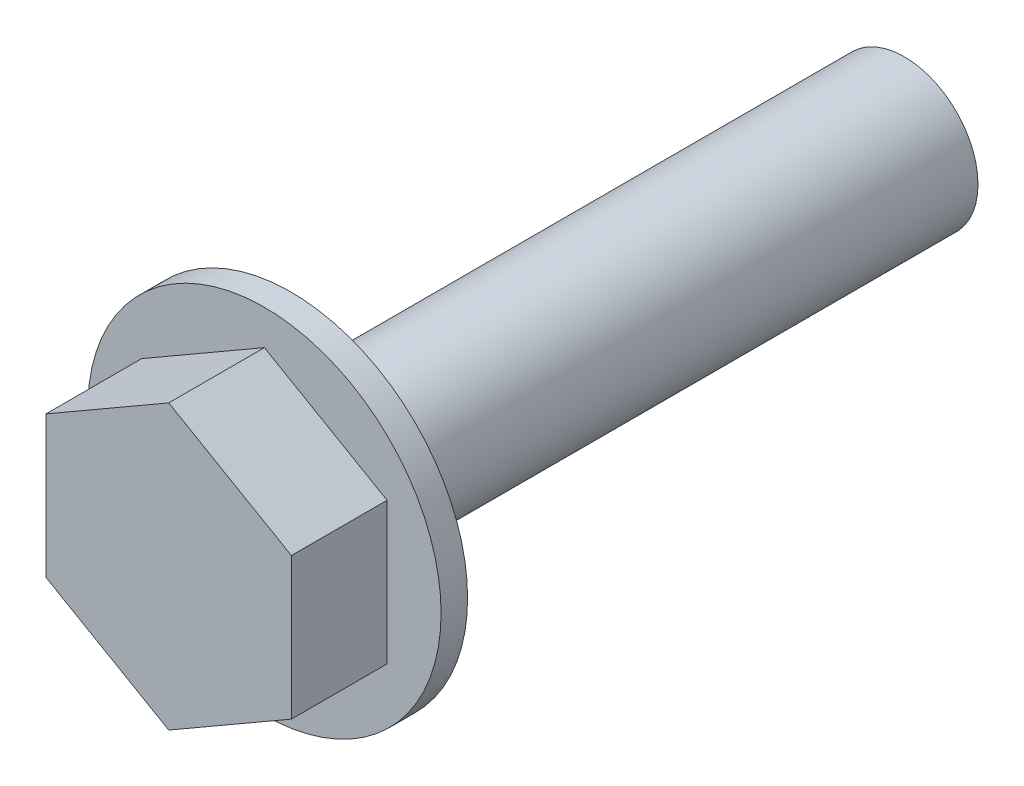
ISO-10303-21;
HEADER;
FILE_DESCRIPTION(('STEP AP214'),'2;1');
FILE_NAME('part.step','',(''),(''),'','','');
FILE_SCHEMA(('AUTOMOTIVE_DESIGN { 1 0 10303 214 1 1 1 1 }'));
ENDSEC;
DATA;
#1=APPLICATION_CONTEXT('core data for automotive mechanical design processes');
#2=APPLICATION_PROTOCOL_DEFINITION('international standard','automotive_design',2000,#1);
#3=PRODUCT_CONTEXT('',#1,'mechanical');
#4=PRODUCT('Part','Part','',(#3));
#5=PRODUCT_RELATED_PRODUCT_CATEGORY('part','',(#4));
#6=PRODUCT_DEFINITION_FORMATION('','',#4);
#7=PRODUCT_DEFINITION_CONTEXT('part definition',#1,'design');
#8=PRODUCT_DEFINITION('design','',#6,#7);
#9=PRODUCT_DEFINITION_SHAPE('','',#8);
#10=(LENGTH_UNIT() NAMED_UNIT(*) SI_UNIT(.MILLI.,.METRE.));
#11=(NAMED_UNIT(*) PLANE_ANGLE_UNIT() SI_UNIT($,.RADIAN.));
#12=(NAMED_UNIT(*) SI_UNIT($,.STERADIAN.) SOLID_ANGLE_UNIT());
#13=UNCERTAINTY_MEASURE_WITH_UNIT(LENGTH_MEASURE(1.E-05),#10,'distance_accuracy_value','');
#14=(GEOMETRIC_REPRESENTATION_CONTEXT(3) GLOBAL_UNCERTAINTY_ASSIGNED_CONTEXT((#13)) GLOBAL_UNIT_ASSIGNED_CONTEXT((#10,
#11,#12)) REPRESENTATION_CONTEXT('',''));
#15=CARTESIAN_POINT('',(0.,0.,0.));
#16=DIRECTION('',(0.,0.,1.));
#17=DIRECTION('',(1.,0.,0.));
#18=AXIS2_PLACEMENT_3D('',#15,#16,#17);
#19=CARTESIAN_POINT('',(5.,-2.88675134594813,4.98));
#20=DIRECTION('',(-1.,0.,0.));
#21=DIRECTION('',(0.,-1.,0.));
#22=AXIS2_PLACEMENT_3D('',#19,#20,#21);
#23=PLANE('',#22);
#24=DIRECTION('',(0.,1.,0.));
#25=VECTOR('',#24,1.);
#26=CARTESIAN_POINT('',(5.,-2.88675134594813,1.08));
#27=LINE('',#26,#25);
#28=CARTESIAN_POINT('',(5.,-2.88675134594813,1.08));
#29=VERTEX_POINT('',#28);
#30=CARTESIAN_POINT('',(5.,2.88675134594813,1.08));
#31=VERTEX_POINT('',#30);
#32=EDGE_CURVE('E95',#29,#31,#27,.T.);
#33=ORIENTED_EDGE('',*,*,#32,.T.);
#34=DIRECTION('',(0.,0.,-1.));
#35=VECTOR('',#34,1.);
#36=CARTESIAN_POINT('',(5.,2.88675134594813,4.98));
#37=LINE('',#36,#35);
#38=CARTESIAN_POINT('',(5.,2.88675134594813,4.98));
#39=VERTEX_POINT('',#38);
#40=EDGE_CURVE('E11',#39,#31,#37,.T.);
#41=ORIENTED_EDGE('',*,*,#40,.F.);
#42=DIRECTION('',(0.,1.,0.));
#43=VECTOR('',#42,1.);
#44=CARTESIAN_POINT('',(5.,-2.88675134594813,4.98));
#45=LINE('',#44,#43);
#46=CARTESIAN_POINT('',(5.,-2.88675134594813,4.98));
#47=VERTEX_POINT('',#46);
#48=EDGE_CURVE('E124',#47,#39,#45,.T.);
#49=ORIENTED_EDGE('',*,*,#48,.F.);
#50=DIRECTION('',(0.,0.,-1.));
#51=VECTOR('',#50,1.);
#52=CARTESIAN_POINT('',(5.,-2.88675134594813,4.98));
#53=LINE('',#52,#51);
#54=EDGE_CURVE('E106',#47,#29,#53,.T.);
#55=ORIENTED_EDGE('',*,*,#54,.T.);
#56=EDGE_LOOP('',(#33,#41,#49,#55));
#57=FACE_BOUND('',#56,.T.);
#58=ADVANCED_FACE('F41',(#57),#23,.F.);
#59=CARTESIAN_POINT('',(5.,2.88675134594813,4.98));
#60=DIRECTION('',(-0.5,-0.866025403784439,0.));
#61=DIRECTION('',(0.866025403784439,-0.5,0.));
#62=AXIS2_PLACEMENT_3D('',#59,#60,#61);
#63=PLANE('',#62);
#64=DIRECTION('',(-0.866025403784439,0.5,0.));
#65=VECTOR('',#64,1.);
#66=CARTESIAN_POINT('',(5.,2.88675134594813,1.08));
#67=LINE('',#66,#65);
#68=CARTESIAN_POINT('',(0.,5.77350269189626,1.08));
#69=VERTEX_POINT('',#68);
#70=EDGE_CURVE('E90',#31,#69,#67,.T.);
#71=ORIENTED_EDGE('',*,*,#70,.T.);
#72=DIRECTION('',(0.,0.,-1.));
#73=VECTOR('',#72,1.);
#74=CARTESIAN_POINT('',(0.,5.77350269189626,4.98));
#75=LINE('',#74,#73);
#76=CARTESIAN_POINT('',(0.,5.77350269189626,4.98));
#77=VERTEX_POINT('',#76);
#78=EDGE_CURVE('E47',#77,#69,#75,.T.);
#79=ORIENTED_EDGE('',*,*,#78,.F.);
#80=DIRECTION('',(-0.866025403784439,0.5,0.));
#81=VECTOR('',#80,1.);
#82=CARTESIAN_POINT('',(5.,2.88675134594813,4.98));
#83=LINE('',#82,#81);
#84=EDGE_CURVE('E105',#39,#77,#83,.T.);
#85=ORIENTED_EDGE('',*,*,#84,.F.);
#86=ORIENTED_EDGE('',*,*,#40,.T.);
#87=EDGE_LOOP('',(#71,#79,#85,#86));
#88=FACE_BOUND('',#87,.T.);
#89=ADVANCED_FACE('F101',(#88),#63,.F.);
#90=CARTESIAN_POINT('',(0.,5.77350269189626,4.98));
#91=DIRECTION('',(0.5,-0.866025403784439,0.));
#92=DIRECTION('',(0.866025403784439,0.5,0.));
#93=AXIS2_PLACEMENT_3D('',#90,#91,#92);
#94=PLANE('',#93);
#95=DIRECTION('',(-0.866025403784439,-0.5,0.));
#96=VECTOR('',#95,1.);
#97=CARTESIAN_POINT('',(0.,5.77350269189626,1.08));
#98=LINE('',#97,#96);
#99=CARTESIAN_POINT('',(-5.,2.88675134594813,1.08));
#100=VERTEX_POINT('',#99);
#101=EDGE_CURVE('E92',#69,#100,#98,.T.);
#102=ORIENTED_EDGE('',*,*,#101,.T.);
#103=DIRECTION('',(0.,0.,-1.));
#104=VECTOR('',#103,1.);
#105=CARTESIAN_POINT('',(-5.,2.88675134594813,4.98));
#106=LINE('',#105,#104);
#107=CARTESIAN_POINT('',(-5.,2.88675134594813,4.98));
#108=VERTEX_POINT('',#107);
#109=EDGE_CURVE('E135',#108,#100,#106,.T.);
#110=ORIENTED_EDGE('',*,*,#109,.F.);
#111=DIRECTION('',(-0.866025403784439,-0.5,0.));
#112=VECTOR('',#111,1.);
#113=CARTESIAN_POINT('',(0.,5.77350269189626,4.98));
#114=LINE('',#113,#112);
#115=EDGE_CURVE('E138',#77,#108,#114,.T.);
#116=ORIENTED_EDGE('',*,*,#115,.F.);
#117=ORIENTED_EDGE('',*,*,#78,.T.);
#118=EDGE_LOOP('',(#102,#110,#116,#117));
#119=FACE_BOUND('',#118,.T.);
#120=ADVANCED_FACE('F137',(#119),#94,.F.);
#121=CARTESIAN_POINT('',(-5.,2.88675134594813,4.98));
#122=DIRECTION('',(1.,0.,0.));
#123=DIRECTION('',(0.,1.,0.));
#124=AXIS2_PLACEMENT_3D('',#121,#122,#123);
#125=PLANE('',#124);
#126=DIRECTION('',(0.,-1.,0.));
#127=VECTOR('',#126,1.);
#128=CARTESIAN_POINT('',(-5.,2.88675134594813,1.08));
#129=LINE('',#128,#127);
#130=CARTESIAN_POINT('',(-5.,-2.88675134594813,1.08));
#131=VERTEX_POINT('',#130);
#132=EDGE_CURVE('E117',#100,#131,#129,.T.);
#133=ORIENTED_EDGE('',*,*,#132,.T.);
#134=DIRECTION('',(0.,0.,-1.));
#135=VECTOR('',#134,1.);
#136=CARTESIAN_POINT('',(-5.,-2.88675134594813,4.98));
#137=LINE('',#136,#135);
#138=CARTESIAN_POINT('',(-5.,-2.88675134594813,4.98));
#139=VERTEX_POINT('',#138);
#140=EDGE_CURVE('E129',#139,#131,#137,.T.);
#141=ORIENTED_EDGE('',*,*,#140,.F.);
#142=DIRECTION('',(0.,-1.,0.));
#143=VECTOR('',#142,1.);
#144=CARTESIAN_POINT('',(-5.,2.88675134594813,4.98));
#145=LINE('',#144,#143);
#146=EDGE_CURVE('E136',#108,#139,#145,.T.);
#147=ORIENTED_EDGE('',*,*,#146,.F.);
#148=ORIENTED_EDGE('',*,*,#109,.T.);
#149=EDGE_LOOP('',(#133,#141,#147,#148));
#150=FACE_BOUND('',#149,.T.);
#151=ADVANCED_FACE('F179',(#150),#125,.F.);
#152=CARTESIAN_POINT('',(-5.,-2.88675134594813,4.98));
#153=DIRECTION('',(0.5,0.866025403784438,0.));
#154=DIRECTION('',(-0.866025403784439,0.5,0.));
#155=AXIS2_PLACEMENT_3D('',#152,#153,#154);
#156=PLANE('',#155);
#157=DIRECTION('',(0.866025403784438,-0.5,0.));
#158=VECTOR('',#157,1.);
#159=CARTESIAN_POINT('',(-5.,-2.88675134594813,1.08));
#160=LINE('',#159,#158);
#161=CARTESIAN_POINT('',(0.,-5.77350269189626,1.08));
#162=VERTEX_POINT('',#161);
#163=EDGE_CURVE('E116',#131,#162,#160,.T.);
#164=ORIENTED_EDGE('',*,*,#163,.T.);
#165=DIRECTION('',(0.,0.,-1.));
#166=VECTOR('',#165,1.);
#167=CARTESIAN_POINT('',(0.,-5.77350269189626,4.98));
#168=LINE('',#167,#166);
#169=CARTESIAN_POINT('',(0.,-5.77350269189626,4.98));
#170=VERTEX_POINT('',#169);
#171=EDGE_CURVE('E127',#170,#162,#168,.T.);
#172=ORIENTED_EDGE('',*,*,#171,.F.);
#173=DIRECTION('',(0.866025403784438,-0.5,0.));
#174=VECTOR('',#173,1.);
#175=CARTESIAN_POINT('',(-5.,-2.88675134594813,4.98));
#176=LINE('',#175,#174);
#177=EDGE_CURVE('E142',#139,#170,#176,.T.);
#178=ORIENTED_EDGE('',*,*,#177,.F.);
#179=ORIENTED_EDGE('',*,*,#140,.T.);
#180=EDGE_LOOP('',(#164,#172,#178,#179));
#181=FACE_BOUND('',#180,.T.);
#182=ADVANCED_FACE('F151',(#181),#156,.F.);
#183=CARTESIAN_POINT('',(0.,-5.77350269189626,4.98));
#184=DIRECTION('',(-0.5,0.866025403784438,0.));
#185=DIRECTION('',(-0.866025403784439,-0.5,0.));
#186=AXIS2_PLACEMENT_3D('',#183,#184,#185);
#187=PLANE('',#186);
#188=DIRECTION('',(0.866025403784438,0.5,0.));
#189=VECTOR('',#188,1.);
#190=CARTESIAN_POINT('',(0.,-5.77350269189626,1.08));
#191=LINE('',#190,#189);
#192=EDGE_CURVE('E125',#162,#29,#191,.T.);
#193=ORIENTED_EDGE('',*,*,#192,.T.);
#194=ORIENTED_EDGE('',*,*,#54,.F.);
#195=DIRECTION('',(0.866025403784438,0.5,0.));
#196=VECTOR('',#195,1.);
#197=CARTESIAN_POINT('',(0.,-5.77350269189626,4.98));
#198=LINE('',#197,#196);
#199=EDGE_CURVE('E57',#170,#47,#198,.T.);
#200=ORIENTED_EDGE('',*,*,#199,.F.);
#201=ORIENTED_EDGE('',*,*,#171,.T.);
#202=EDGE_LOOP('',(#193,#194,#200,#201));
#203=FACE_BOUND('',#202,.T.);
#204=ADVANCED_FACE('F153',(#203),#187,.F.);
#205=CARTESIAN_POINT('',(0.,0.,4.98));
#206=DIRECTION('',(0.,0.,1.));
#207=DIRECTION('',(1.,0.,0.));
#208=AXIS2_PLACEMENT_3D('',#205,#206,#207);
#209=PLANE('',#208);
#210=ORIENTED_EDGE('',*,*,#48,.T.);
#211=ORIENTED_EDGE('',*,*,#84,.T.);
#212=ORIENTED_EDGE('',*,*,#115,.T.);
#213=ORIENTED_EDGE('',*,*,#146,.T.);
#214=ORIENTED_EDGE('',*,*,#177,.T.);
#215=ORIENTED_EDGE('',*,*,#199,.T.);
#216=EDGE_LOOP('',(#210,#211,#212,#213,#214,#215));
#217=FACE_BOUND('',#216,.T.);
#218=ADVANCED_FACE('F146',(#217),#209,.T.);
#219=CARTESIAN_POINT('',(0.,0.,1.08));
#220=DIRECTION('',(0.,0.,1.));
#221=DIRECTION('',(1.,0.,0.));
#222=AXIS2_PLACEMENT_3D('',#219,#220,#221);
#223=PLANE('',#222);
#224=CARTESIAN_POINT('',(0.,0.,1.08));
#225=DIRECTION('',(0.,0.,1.));
#226=DIRECTION('',(1.,0.,0.));
#227=AXIS2_PLACEMENT_3D('',#224,#225,#226);
#228=CIRCLE('',#227,7.2);
#229=CARTESIAN_POINT('',(7.2,0.,1.08));
#230=VERTEX_POINT('',#229);
#231=EDGE_CURVE('E109',#230,#230,#228,.T.);
#232=ORIENTED_EDGE('',*,*,#231,.T.);
#233=EDGE_LOOP('',(#232));
#234=FACE_BOUND('',#233,.T.);
#235=ORIENTED_EDGE('',*,*,#32,.F.);
#236=ORIENTED_EDGE('',*,*,#192,.F.);
#237=ORIENTED_EDGE('',*,*,#163,.F.);
#238=ORIENTED_EDGE('',*,*,#132,.F.);
#239=ORIENTED_EDGE('',*,*,#101,.F.);
#240=ORIENTED_EDGE('',*,*,#70,.F.);
#241=EDGE_LOOP('',(#235,#236,#237,#238,#239,#240));
#242=FACE_BOUND('',#241,.T.);
#243=ADVANCED_FACE('F89',(#234,#242),#223,.T.);
#244=CARTESIAN_POINT('',(0.,0.,1.08));
#245=DIRECTION('',(0.,0.,-1.));
#246=DIRECTION('',(-1.,0.,0.));
#247=AXIS2_PLACEMENT_3D('',#244,#245,#246);
#248=CYLINDRICAL_SURFACE('',#247,7.2);
#249=ORIENTED_EDGE('',*,*,#231,.F.);
#250=EDGE_LOOP('',(#249));
#251=FACE_BOUND('',#250,.T.);
#252=CARTESIAN_POINT('',(0.,0.,0.));
#253=DIRECTION('',(0.,0.,1.));
#254=DIRECTION('',(1.,0.,0.));
#255=AXIS2_PLACEMENT_3D('',#252,#253,#254);
#256=CIRCLE('',#255,7.2);
#257=CARTESIAN_POINT('',(7.2,0.,0.));
#258=VERTEX_POINT('',#257);
#259=EDGE_CURVE('E154',#258,#258,#256,.T.);
#260=ORIENTED_EDGE('',*,*,#259,.T.);
#261=EDGE_LOOP('',(#260));
#262=FACE_BOUND('',#261,.T.);
#263=ADVANCED_FACE('F192',(#251,#262),#248,.T.);
#264=CARTESIAN_POINT('',(0.,0.,0.));
#265=DIRECTION('',(0.,0.,1.));
#266=DIRECTION('',(1.,0.,0.));
#267=AXIS2_PLACEMENT_3D('',#264,#265,#266);
#268=PLANE('',#267);
#269=CARTESIAN_POINT('',(0.,0.,0.));
#270=DIRECTION('',(0.,0.,1.));
#271=DIRECTION('',(1.,0.,0.));
#272=AXIS2_PLACEMENT_3D('',#269,#270,#271);
#273=CIRCLE('',#272,3.);
#274=CARTESIAN_POINT('',(3.,0.,0.));
#275=VERTEX_POINT('',#274);
#276=EDGE_CURVE('E110',#275,#275,#273,.F.);
#277=ORIENTED_EDGE('',*,*,#276,.F.);
#278=EDGE_LOOP('',(#277));
#279=FACE_BOUND('',#278,.T.);
#280=ORIENTED_EDGE('',*,*,#259,.F.);
#281=EDGE_LOOP('',(#280));
#282=FACE_BOUND('',#281,.T.);
#283=ADVANCED_FACE('F175',(#279,#282),#268,.F.);
#284=CARTESIAN_POINT('',(0.,0.,0.00999999999999959));
#285=DIRECTION('',(0.,0.,-1.));
#286=DIRECTION('',(-1.,0.,0.));
#287=AXIS2_PLACEMENT_3D('',#284,#285,#286);
#288=CYLINDRICAL_SURFACE('',#287,3.);
#289=CARTESIAN_POINT('',(0.,0.,-25.));
#290=DIRECTION('',(0.,0.,1.));
#291=DIRECTION('',(1.,0.,0.));
#292=AXIS2_PLACEMENT_3D('',#289,#290,#291);
#293=CIRCLE('',#292,3.);
#294=CARTESIAN_POINT('',(3.,0.,-25.));
#295=VERTEX_POINT('',#294);
#296=EDGE_CURVE('E158',#295,#295,#293,.T.);
#297=ORIENTED_EDGE('',*,*,#296,.T.);
#298=EDGE_LOOP('',(#297));
#299=FACE_BOUND('',#298,.T.);
#300=ORIENTED_EDGE('',*,*,#276,.T.);
#301=EDGE_LOOP('',(#300));
#302=FACE_BOUND('',#301,.T.);
#303=ADVANCED_FACE('F163',(#299,#302),#288,.T.);
#304=CARTESIAN_POINT('',(0.,0.,-25.));
#305=DIRECTION('',(0.,0.,1.));
#306=DIRECTION('',(1.,0.,0.));
#307=AXIS2_PLACEMENT_3D('',#304,#305,#306);
#308=PLANE('',#307);
#309=ORIENTED_EDGE('',*,*,#296,.F.);
#310=EDGE_LOOP('',(#309));
#311=FACE_BOUND('',#310,.T.);
#312=ADVANCED_FACE('F170',(#311),#308,.F.);
#313=CLOSED_SHELL('',(#58,#89,#120,#151,#182,#204,#218,#243,#263,#283,#303,#312));
#314=MANIFOLD_SOLID_BREP('B2',#313);
#315=ADVANCED_BREP_SHAPE_REPRESENTATION('',(#18,#314),#14);
#316=SHAPE_DEFINITION_REPRESENTATION(#9,#315);
ENDSEC;
END-ISO-10303-21;
